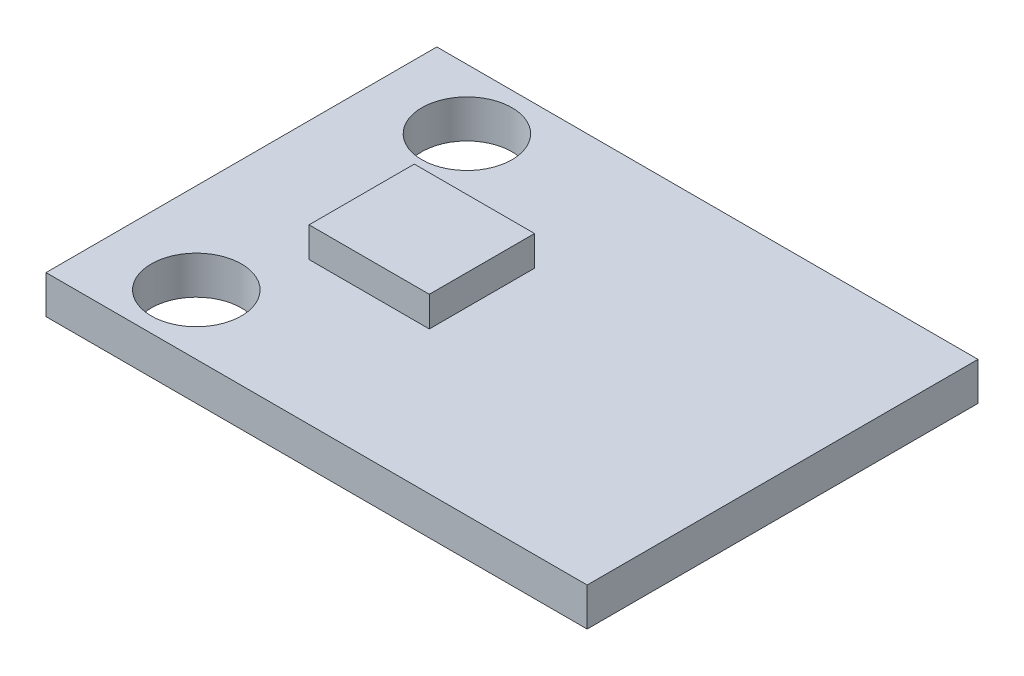
ISO-10303-21;
HEADER;
FILE_DESCRIPTION(('STEP AP214'),'2;1');
FILE_NAME('part.step','',(''),(''),'','','');
FILE_SCHEMA(('AUTOMOTIVE_DESIGN { 1 0 10303 214 1 1 1 1 }'));
ENDSEC;
DATA;
#1=APPLICATION_CONTEXT('core data for automotive mechanical design processes');
#2=APPLICATION_PROTOCOL_DEFINITION('international standard','automotive_design',2000,#1);
#3=PRODUCT_CONTEXT('',#1,'mechanical');
#4=PRODUCT('Part','Part','',(#3));
#5=PRODUCT_RELATED_PRODUCT_CATEGORY('part','',(#4));
#6=PRODUCT_DEFINITION_FORMATION('','',#4);
#7=PRODUCT_DEFINITION_CONTEXT('part definition',#1,'design');
#8=PRODUCT_DEFINITION('design','',#6,#7);
#9=PRODUCT_DEFINITION_SHAPE('','',#8);
#10=(LENGTH_UNIT() NAMED_UNIT(*) SI_UNIT(.MILLI.,.METRE.));
#11=(NAMED_UNIT(*) PLANE_ANGLE_UNIT() SI_UNIT($,.RADIAN.));
#12=(NAMED_UNIT(*) SI_UNIT($,.STERADIAN.) SOLID_ANGLE_UNIT());
#13=UNCERTAINTY_MEASURE_WITH_UNIT(LENGTH_MEASURE(1.E-05),#10,'distance_accuracy_value','');
#14=(GEOMETRIC_REPRESENTATION_CONTEXT(3) GLOBAL_UNCERTAINTY_ASSIGNED_CONTEXT((#13)) GLOBAL_UNIT_ASSIGNED_CONTEXT((#10,
#11,#12)) REPRESENTATION_CONTEXT('',''));
#15=CARTESIAN_POINT('',(0.,0.,0.));
#16=DIRECTION('',(0.,0.,1.));
#17=DIRECTION('',(1.,0.,0.));
#18=AXIS2_PLACEMENT_3D('',#15,#16,#17);
#19=CARTESIAN_POINT('',(0.,1.27,0.));
#20=DIRECTION('',(0.,1.,0.));
#21=DIRECTION('',(0.,0.,1.));
#22=AXIS2_PLACEMENT_3D('',#19,#20,#21);
#23=PLANE('',#22);
#24=CARTESIAN_POINT('',(-6.,1.27,4.5));
#25=DIRECTION('',(0.,1.,0.));
#26=DIRECTION('',(0.,0.,1.));
#27=AXIS2_PLACEMENT_3D('',#24,#25,#26);
#28=CIRCLE('',#27,1.5);
#29=CARTESIAN_POINT('',(-6.,1.27,6.));
#30=VERTEX_POINT('',#29);
#31=EDGE_CURVE('E148',#30,#30,#28,.T.);
#32=ORIENTED_EDGE('',*,*,#31,.F.);
#33=EDGE_LOOP('',(#32));
#34=FACE_BOUND('',#33,.T.);
#35=CARTESIAN_POINT('',(-6.,1.27,-4.5));
#36=DIRECTION('',(0.,1.,0.));
#37=DIRECTION('',(0.,0.,1.));
#38=AXIS2_PLACEMENT_3D('',#35,#36,#37);
#39=CIRCLE('',#38,1.5);
#40=CARTESIAN_POINT('',(-6.,1.27,-3.));
#41=VERTEX_POINT('',#40);
#42=EDGE_CURVE('E158',#41,#41,#39,.T.);
#43=ORIENTED_EDGE('',*,*,#42,.F.);
#44=EDGE_LOOP('',(#43));
#45=FACE_BOUND('',#44,.T.);
#46=DIRECTION('',(0.,0.,1.));
#47=VECTOR('',#46,1.);
#48=CARTESIAN_POINT('',(-9.,1.27,6.5));
#49=LINE('',#48,#47);
#50=CARTESIAN_POINT('',(-9.,1.27,-6.5));
#51=VERTEX_POINT('',#50);
#52=CARTESIAN_POINT('',(-9.,1.27,6.5));
#53=VERTEX_POINT('',#52);
#54=EDGE_CURVE('E165',#51,#53,#49,.T.);
#55=ORIENTED_EDGE('',*,*,#54,.T.);
#56=DIRECTION('',(1.,0.,0.));
#57=VECTOR('',#56,1.);
#58=CARTESIAN_POINT('',(9.,1.27,6.5));
#59=LINE('',#58,#57);
#60=CARTESIAN_POINT('',(9.,1.27,6.5));
#61=VERTEX_POINT('',#60);
#62=EDGE_CURVE('E101',#53,#61,#59,.T.);
#63=ORIENTED_EDGE('',*,*,#62,.T.);
#64=DIRECTION('',(0.,0.,-1.));
#65=VECTOR('',#64,1.);
#66=CARTESIAN_POINT('',(9.,1.27,6.5));
#67=LINE('',#66,#65);
#68=CARTESIAN_POINT('',(9.,1.27,-6.5));
#69=VERTEX_POINT('',#68);
#70=EDGE_CURVE('E168',#61,#69,#67,.T.);
#71=ORIENTED_EDGE('',*,*,#70,.T.);
#72=DIRECTION('',(-1.,0.,0.));
#73=VECTOR('',#72,1.);
#74=CARTESIAN_POINT('',(9.,1.27,-6.5));
#75=LINE('',#74,#73);
#76=EDGE_CURVE('E73',#69,#51,#75,.T.);
#77=ORIENTED_EDGE('',*,*,#76,.T.);
#78=EDGE_LOOP('',(#55,#63,#71,#77));
#79=FACE_BOUND('',#78,.T.);
#80=DIRECTION('',(1.,0.,0.));
#81=VECTOR('',#80,1.);
#82=CARTESIAN_POINT('',(-5.,1.27,1.75));
#83=LINE('',#82,#81);
#84=CARTESIAN_POINT('',(-5.,1.27,1.75));
#85=VERTEX_POINT('',#84);
#86=CARTESIAN_POINT('',(-1.,1.27,1.75));
#87=VERTEX_POINT('',#86);
#88=EDGE_CURVE('E335',#85,#87,#83,.T.);
#89=ORIENTED_EDGE('',*,*,#88,.F.);
#90=DIRECTION('',(0.,0.,1.));
#91=VECTOR('',#90,1.);
#92=CARTESIAN_POINT('',(-5.,1.27,-1.75));
#93=LINE('',#92,#91);
#94=CARTESIAN_POINT('',(-5.,1.27,-1.75));
#95=VERTEX_POINT('',#94);
#96=EDGE_CURVE('E146',#95,#85,#93,.T.);
#97=ORIENTED_EDGE('',*,*,#96,.F.);
#98=DIRECTION('',(-1.,0.,0.));
#99=VECTOR('',#98,1.);
#100=CARTESIAN_POINT('',(-5.,1.27,-1.75));
#101=LINE('',#100,#99);
#102=CARTESIAN_POINT('',(-1.,1.27,-1.75));
#103=VERTEX_POINT('',#102);
#104=EDGE_CURVE('E142',#103,#95,#101,.T.);
#105=ORIENTED_EDGE('',*,*,#104,.F.);
#106=DIRECTION('',(0.,0.,-1.));
#107=VECTOR('',#106,1.);
#108=CARTESIAN_POINT('',(-1.,1.27,-1.75));
#109=LINE('',#108,#107);
#110=EDGE_CURVE('E332',#87,#103,#109,.T.);
#111=ORIENTED_EDGE('',*,*,#110,.F.);
#112=EDGE_LOOP('',(#89,#97,#105,#111));
#113=FACE_BOUND('',#112,.T.);
#114=ADVANCED_FACE('F49',(#34,#45,#79,#113),#23,.T.);
#115=CARTESIAN_POINT('',(-9.,1.27,6.5));
#116=DIRECTION('',(1.,0.,0.));
#117=DIRECTION('',(0.,0.,-1.));
#118=AXIS2_PLACEMENT_3D('',#115,#116,#117);
#119=PLANE('',#118);
#120=DIRECTION('',(0.,0.,1.));
#121=VECTOR('',#120,1.);
#122=CARTESIAN_POINT('',(-9.,0.,6.5));
#123=LINE('',#122,#121);
#124=CARTESIAN_POINT('',(-9.,0.,-6.5));
#125=VERTEX_POINT('',#124);
#126=CARTESIAN_POINT('',(-9.,0.,6.5));
#127=VERTEX_POINT('',#126);
#128=EDGE_CURVE('E164',#125,#127,#123,.T.);
#129=ORIENTED_EDGE('',*,*,#128,.T.);
#130=DIRECTION('',(0.,-1.,0.));
#131=VECTOR('',#130,1.);
#132=CARTESIAN_POINT('',(-9.,1.27,6.5));
#133=LINE('',#132,#131);
#134=EDGE_CURVE('E11',#53,#127,#133,.T.);
#135=ORIENTED_EDGE('',*,*,#134,.F.);
#136=ORIENTED_EDGE('',*,*,#54,.F.);
#137=DIRECTION('',(0.,-1.,0.));
#138=VECTOR('',#137,1.);
#139=CARTESIAN_POINT('',(-9.,1.27,-6.5));
#140=LINE('',#139,#138);
#141=EDGE_CURVE('E171',#51,#125,#140,.T.);
#142=ORIENTED_EDGE('',*,*,#141,.T.);
#143=EDGE_LOOP('',(#129,#135,#136,#142));
#144=FACE_BOUND('',#143,.T.);
#145=ADVANCED_FACE('F51',(#144),#119,.F.);
#146=CARTESIAN_POINT('',(9.,1.27,6.5));
#147=DIRECTION('',(0.,0.,-1.));
#148=DIRECTION('',(-1.,0.,0.));
#149=AXIS2_PLACEMENT_3D('',#146,#147,#148);
#150=PLANE('',#149);
#151=DIRECTION('',(1.,0.,0.));
#152=VECTOR('',#151,1.);
#153=CARTESIAN_POINT('',(9.,0.,6.5));
#154=LINE('',#153,#152);
#155=CARTESIAN_POINT('',(9.,0.,6.5));
#156=VERTEX_POINT('',#155);
#157=EDGE_CURVE('E174',#127,#156,#154,.T.);
#158=ORIENTED_EDGE('',*,*,#157,.T.);
#159=DIRECTION('',(0.,-1.,0.));
#160=VECTOR('',#159,1.);
#161=CARTESIAN_POINT('',(9.,1.27,6.5));
#162=LINE('',#161,#160);
#163=EDGE_CURVE('E57',#61,#156,#162,.T.);
#164=ORIENTED_EDGE('',*,*,#163,.F.);
#165=ORIENTED_EDGE('',*,*,#62,.F.);
#166=ORIENTED_EDGE('',*,*,#134,.T.);
#167=EDGE_LOOP('',(#158,#164,#165,#166));
#168=FACE_BOUND('',#167,.T.);
#169=ADVANCED_FACE('F204',(#168),#150,.F.);
#170=CARTESIAN_POINT('',(9.,1.27,6.5));
#171=DIRECTION('',(-1.,0.,0.));
#172=DIRECTION('',(0.,0.,1.));
#173=AXIS2_PLACEMENT_3D('',#170,#171,#172);
#174=PLANE('',#173);
#175=DIRECTION('',(0.,0.,-1.));
#176=VECTOR('',#175,1.);
#177=CARTESIAN_POINT('',(9.,0.,6.5));
#178=LINE('',#177,#176);
#179=CARTESIAN_POINT('',(9.,0.,-6.5));
#180=VERTEX_POINT('',#179);
#181=EDGE_CURVE('E176',#156,#180,#178,.T.);
#182=ORIENTED_EDGE('',*,*,#181,.T.);
#183=DIRECTION('',(0.,-1.,0.));
#184=VECTOR('',#183,1.);
#185=CARTESIAN_POINT('',(9.,1.27,-6.5));
#186=LINE('',#185,#184);
#187=EDGE_CURVE('E180',#69,#180,#186,.T.);
#188=ORIENTED_EDGE('',*,*,#187,.F.);
#189=ORIENTED_EDGE('',*,*,#70,.F.);
#190=ORIENTED_EDGE('',*,*,#163,.T.);
#191=EDGE_LOOP('',(#182,#188,#189,#190));
#192=FACE_BOUND('',#191,.T.);
#193=ADVANCED_FACE('F185',(#192),#174,.F.);
#194=CARTESIAN_POINT('',(9.,1.27,-6.5));
#195=DIRECTION('',(0.,0.,1.));
#196=DIRECTION('',(1.,0.,0.));
#197=AXIS2_PLACEMENT_3D('',#194,#195,#196);
#198=PLANE('',#197);
#199=DIRECTION('',(-1.,0.,0.));
#200=VECTOR('',#199,1.);
#201=CARTESIAN_POINT('',(9.,0.,-6.5));
#202=LINE('',#201,#200);
#203=EDGE_CURVE('E94',#180,#125,#202,.T.);
#204=ORIENTED_EDGE('',*,*,#203,.T.);
#205=ORIENTED_EDGE('',*,*,#141,.F.);
#206=ORIENTED_EDGE('',*,*,#76,.F.);
#207=ORIENTED_EDGE('',*,*,#187,.T.);
#208=EDGE_LOOP('',(#204,#205,#206,#207));
#209=FACE_BOUND('',#208,.T.);
#210=ADVANCED_FACE('F193',(#209),#198,.F.);
#211=CARTESIAN_POINT('',(0.,0.,0.));
#212=DIRECTION('',(0.,1.,0.));
#213=DIRECTION('',(0.,0.,1.));
#214=AXIS2_PLACEMENT_3D('',#211,#212,#213);
#215=PLANE('',#214);
#216=CARTESIAN_POINT('',(-6.,0.,4.5));
#217=DIRECTION('',(0.,1.,0.));
#218=DIRECTION('',(0.,0.,1.));
#219=AXIS2_PLACEMENT_3D('',#216,#217,#218);
#220=CIRCLE('',#219,1.5);
#221=CARTESIAN_POINT('',(-6.,0.,6.));
#222=VERTEX_POINT('',#221);
#223=EDGE_CURVE('E151',#222,#222,#220,.F.);
#224=ORIENTED_EDGE('',*,*,#223,.F.);
#225=EDGE_LOOP('',(#224));
#226=FACE_BOUND('',#225,.T.);
#227=CARTESIAN_POINT('',(-6.,0.,-4.5));
#228=DIRECTION('',(0.,1.,0.));
#229=DIRECTION('',(0.,0.,1.));
#230=AXIS2_PLACEMENT_3D('',#227,#228,#229);
#231=CIRCLE('',#230,1.5);
#232=CARTESIAN_POINT('',(-6.,0.,-3.));
#233=VERTEX_POINT('',#232);
#234=EDGE_CURVE('E161',#233,#233,#231,.F.);
#235=ORIENTED_EDGE('',*,*,#234,.F.);
#236=EDGE_LOOP('',(#235));
#237=FACE_BOUND('',#236,.T.);
#238=ORIENTED_EDGE('',*,*,#128,.F.);
#239=ORIENTED_EDGE('',*,*,#203,.F.);
#240=ORIENTED_EDGE('',*,*,#181,.F.);
#241=ORIENTED_EDGE('',*,*,#157,.F.);
#242=EDGE_LOOP('',(#238,#239,#240,#241));
#243=FACE_BOUND('',#242,.T.);
#244=ADVANCED_FACE('F189',(#226,#237,#243),#215,.F.);
#245=CARTESIAN_POINT('',(-6.,-0.000999999999999916,-4.5));
#246=DIRECTION('',(0.,1.,0.));
#247=DIRECTION('',(0.,0.,1.));
#248=AXIS2_PLACEMENT_3D('',#245,#246,#247);
#249=CYLINDRICAL_SURFACE('',#248,1.5);
#250=ORIENTED_EDGE('',*,*,#42,.T.);
#251=EDGE_LOOP('',(#250));
#252=FACE_BOUND('',#251,.T.);
#253=ORIENTED_EDGE('',*,*,#234,.T.);
#254=EDGE_LOOP('',(#253));
#255=FACE_BOUND('',#254,.T.);
#256=ADVANCED_FACE('F201',(#252,#255),#249,.F.);
#257=CARTESIAN_POINT('',(-6.,-0.000999999999999916,4.5));
#258=DIRECTION('',(0.,1.,0.));
#259=DIRECTION('',(0.,0.,1.));
#260=AXIS2_PLACEMENT_3D('',#257,#258,#259);
#261=CYLINDRICAL_SURFACE('',#260,1.5);
#262=ORIENTED_EDGE('',*,*,#31,.T.);
#263=EDGE_LOOP('',(#262));
#264=FACE_BOUND('',#263,.T.);
#265=ORIENTED_EDGE('',*,*,#223,.T.);
#266=EDGE_LOOP('',(#265));
#267=FACE_BOUND('',#266,.T.);
#268=ADVANCED_FACE('F218',(#264,#267),#261,.F.);
#269=CARTESIAN_POINT('',(-5.,2.27,-1.75));
#270=DIRECTION('',(1.,0.,0.));
#271=DIRECTION('',(0.,0.,-1.));
#272=AXIS2_PLACEMENT_3D('',#269,#270,#271);
#273=PLANE('',#272);
#274=ORIENTED_EDGE('',*,*,#96,.T.);
#275=DIRECTION('',(0.,-1.,0.));
#276=VECTOR('',#275,1.);
#277=CARTESIAN_POINT('',(-5.,2.27,1.75));
#278=LINE('',#277,#276);
#279=CARTESIAN_POINT('',(-5.,2.27,1.75));
#280=VERTEX_POINT('',#279);
#281=EDGE_CURVE('E127',#280,#85,#278,.T.);
#282=ORIENTED_EDGE('',*,*,#281,.F.);
#283=DIRECTION('',(0.,0.,1.));
#284=VECTOR('',#283,1.);
#285=CARTESIAN_POINT('',(-5.,2.27,-1.75));
#286=LINE('',#285,#284);
#287=CARTESIAN_POINT('',(-5.,2.27,-1.75));
#288=VERTEX_POINT('',#287);
#289=EDGE_CURVE('E134',#288,#280,#286,.T.);
#290=ORIENTED_EDGE('',*,*,#289,.F.);
#291=DIRECTION('',(0.,-1.,0.));
#292=VECTOR('',#291,1.);
#293=CARTESIAN_POINT('',(-5.,2.27,-1.75));
#294=LINE('',#293,#292);
#295=EDGE_CURVE('E329',#288,#95,#294,.T.);
#296=ORIENTED_EDGE('',*,*,#295,.T.);
#297=EDGE_LOOP('',(#274,#282,#290,#296));
#298=FACE_BOUND('',#297,.T.);
#299=ADVANCED_FACE('F144',(#298),#273,.F.);
#300=CARTESIAN_POINT('',(-5.,2.27,1.75));
#301=DIRECTION('',(0.,0.,-1.));
#302=DIRECTION('',(-1.,0.,0.));
#303=AXIS2_PLACEMENT_3D('',#300,#301,#302);
#304=PLANE('',#303);
#305=ORIENTED_EDGE('',*,*,#88,.T.);
#306=DIRECTION('',(0.,-1.,0.));
#307=VECTOR('',#306,1.);
#308=CARTESIAN_POINT('',(-1.,2.27,1.75));
#309=LINE('',#308,#307);
#310=CARTESIAN_POINT('',(-1.,2.27,1.75));
#311=VERTEX_POINT('',#310);
#312=EDGE_CURVE('E130',#311,#87,#309,.T.);
#313=ORIENTED_EDGE('',*,*,#312,.F.);
#314=DIRECTION('',(1.,0.,0.));
#315=VECTOR('',#314,1.);
#316=CARTESIAN_POINT('',(-5.,2.27,1.75));
#317=LINE('',#316,#315);
#318=EDGE_CURVE('E123',#280,#311,#317,.T.);
#319=ORIENTED_EDGE('',*,*,#318,.F.);
#320=ORIENTED_EDGE('',*,*,#281,.T.);
#321=EDGE_LOOP('',(#305,#313,#319,#320));
#322=FACE_BOUND('',#321,.T.);
#323=ADVANCED_FACE('F125',(#322),#304,.F.);
#324=CARTESIAN_POINT('',(-1.,2.27,-1.75));
#325=DIRECTION('',(-1.,0.,0.));
#326=DIRECTION('',(0.,0.,1.));
#327=AXIS2_PLACEMENT_3D('',#324,#325,#326);
#328=PLANE('',#327);
#329=ORIENTED_EDGE('',*,*,#110,.T.);
#330=DIRECTION('',(0.,-1.,0.));
#331=VECTOR('',#330,1.);
#332=CARTESIAN_POINT('',(-1.,2.27,-1.75));
#333=LINE('',#332,#331);
#334=CARTESIAN_POINT('',(-1.,2.27,-1.75));
#335=VERTEX_POINT('',#334);
#336=EDGE_CURVE('E64',#335,#103,#333,.T.);
#337=ORIENTED_EDGE('',*,*,#336,.F.);
#338=DIRECTION('',(0.,0.,-1.));
#339=VECTOR('',#338,1.);
#340=CARTESIAN_POINT('',(-1.,2.27,-1.75));
#341=LINE('',#340,#339);
#342=EDGE_CURVE('E133',#311,#335,#341,.T.);
#343=ORIENTED_EDGE('',*,*,#342,.F.);
#344=ORIENTED_EDGE('',*,*,#312,.T.);
#345=EDGE_LOOP('',(#329,#337,#343,#344));
#346=FACE_BOUND('',#345,.T.);
#347=ADVANCED_FACE('F226',(#346),#328,.F.);
#348=CARTESIAN_POINT('',(-5.,2.27,-1.75));
#349=DIRECTION('',(0.,0.,1.));
#350=DIRECTION('',(1.,0.,0.));
#351=AXIS2_PLACEMENT_3D('',#348,#349,#350);
#352=PLANE('',#351);
#353=ORIENTED_EDGE('',*,*,#104,.T.);
#354=ORIENTED_EDGE('',*,*,#295,.F.);
#355=DIRECTION('',(-1.,0.,0.));
#356=VECTOR('',#355,1.);
#357=CARTESIAN_POINT('',(-5.,2.27,-1.75));
#358=LINE('',#357,#356);
#359=EDGE_CURVE('E138',#335,#288,#358,.T.);
#360=ORIENTED_EDGE('',*,*,#359,.F.);
#361=ORIENTED_EDGE('',*,*,#336,.T.);
#362=EDGE_LOOP('',(#353,#354,#360,#361));
#363=FACE_BOUND('',#362,.T.);
#364=ADVANCED_FACE('F229',(#363),#352,.F.);
#365=CARTESIAN_POINT('',(0.,2.27,0.));
#366=DIRECTION('',(0.,1.,0.));
#367=DIRECTION('',(0.,0.,1.));
#368=AXIS2_PLACEMENT_3D('',#365,#366,#367);
#369=PLANE('',#368);
#370=ORIENTED_EDGE('',*,*,#289,.T.);
#371=ORIENTED_EDGE('',*,*,#318,.T.);
#372=ORIENTED_EDGE('',*,*,#342,.T.);
#373=ORIENTED_EDGE('',*,*,#359,.T.);
#374=EDGE_LOOP('',(#370,#371,#372,#373));
#375=FACE_BOUND('',#374,.T.);
#376=ADVANCED_FACE('F137',(#375),#369,.T.);
#377=CLOSED_SHELL('',(#114,#145,#169,#193,#210,#244,#256,#268,#299,#323,#347,#364,#376));
#378=MANIFOLD_SOLID_BREP('B2',#377);
#379=ADVANCED_BREP_SHAPE_REPRESENTATION('',(#18,#378),#14);
#380=SHAPE_DEFINITION_REPRESENTATION(#9,#379);
ENDSEC;
END-ISO-10303-21;
